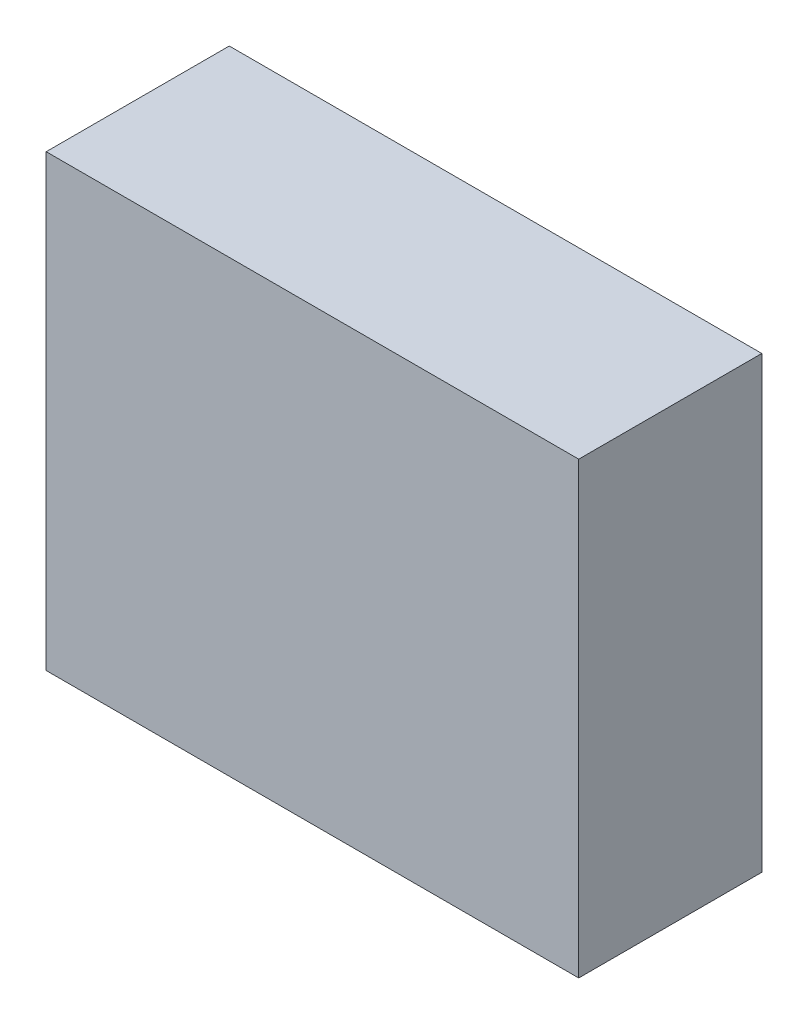
ISO-10303-21;
HEADER;
FILE_DESCRIPTION(('STEP AP214'),'2;1');
FILE_NAME('part.step','',(''),(''),'','','');
FILE_SCHEMA(('AUTOMOTIVE_DESIGN { 1 0 10303 214 1 1 1 1 }'));
ENDSEC;
DATA;
#1=APPLICATION_CONTEXT('core data for automotive mechanical design processes');
#2=APPLICATION_PROTOCOL_DEFINITION('international standard','automotive_design',2000,#1);
#3=PRODUCT_CONTEXT('',#1,'mechanical');
#4=PRODUCT('Part','Part','',(#3));
#5=PRODUCT_RELATED_PRODUCT_CATEGORY('part','',(#4));
#6=PRODUCT_DEFINITION_FORMATION('','',#4);
#7=PRODUCT_DEFINITION_CONTEXT('part definition',#1,'design');
#8=PRODUCT_DEFINITION('design','',#6,#7);
#9=PRODUCT_DEFINITION_SHAPE('','',#8);
#10=(LENGTH_UNIT() NAMED_UNIT(*) SI_UNIT(.MILLI.,.METRE.));
#11=(NAMED_UNIT(*) PLANE_ANGLE_UNIT() SI_UNIT($,.RADIAN.));
#12=(NAMED_UNIT(*) SI_UNIT($,.STERADIAN.) SOLID_ANGLE_UNIT());
#13=UNCERTAINTY_MEASURE_WITH_UNIT(LENGTH_MEASURE(1.E-05),#10,'distance_accuracy_value','');
#14=(GEOMETRIC_REPRESENTATION_CONTEXT(3) GLOBAL_UNCERTAINTY_ASSIGNED_CONTEXT((#13)) GLOBAL_UNIT_ASSIGNED_CONTEXT((#10,
#11,#12)) REPRESENTATION_CONTEXT('',''));
#15=CARTESIAN_POINT('',(0.,0.,0.));
#16=DIRECTION('',(0.,0.,1.));
#17=DIRECTION('',(1.,0.,0.));
#18=AXIS2_PLACEMENT_3D('',#15,#16,#17);
#19=CARTESIAN_POINT('',(17.750028,42.900092,1.422654));
#20=DIRECTION('',(1.,0.,0.));
#21=DIRECTION('',(0.,1.,0.));
#22=AXIS2_PLACEMENT_3D('',#19,#20,#21);
#23=PLANE('',#22);
#24=DIRECTION('',(0.,0.,1.));
#25=VECTOR('',#24,1.);
#26=CARTESIAN_POINT('',(17.750028,40.200072,0.32258));
#27=LINE('',#26,#25);
#28=CARTESIAN_POINT('',(17.750028,40.200072,0.32258));
#29=VERTEX_POINT('',#28);
#30=CARTESIAN_POINT('',(17.750028,40.200072,1.422654));
#31=VERTEX_POINT('',#30);
#32=EDGE_CURVE('E11',#29,#31,#27,.T.);
#33=ORIENTED_EDGE('',*,*,#32,.T.);
#34=DIRECTION('',(0.,1.,0.));
#35=VECTOR('',#34,1.);
#36=CARTESIAN_POINT('',(17.750028,40.200072,1.422654));
#37=LINE('',#36,#35);
#38=CARTESIAN_POINT('',(17.750028,42.900092,1.422654));
#39=VERTEX_POINT('',#38);
#40=EDGE_CURVE('E75',#31,#39,#37,.T.);
#41=ORIENTED_EDGE('',*,*,#40,.T.);
#42=DIRECTION('',(0.,0.,1.));
#43=VECTOR('',#42,1.);
#44=CARTESIAN_POINT('',(17.750028,42.900092,0.32258));
#45=LINE('',#44,#43);
#46=CARTESIAN_POINT('',(17.750028,42.900092,0.32258));
#47=VERTEX_POINT('',#46);
#48=EDGE_CURVE('E71',#47,#39,#45,.T.);
#49=ORIENTED_EDGE('',*,*,#48,.F.);
#50=DIRECTION('',(0.,-1.,0.));
#51=VECTOR('',#50,1.);
#52=CARTESIAN_POINT('',(17.750028,42.900092,0.32258));
#53=LINE('',#52,#51);
#54=EDGE_CURVE('E99',#47,#29,#53,.T.);
#55=ORIENTED_EDGE('',*,*,#54,.T.);
#56=EDGE_LOOP('',(#33,#41,#49,#55));
#57=FACE_BOUND('',#56,.T.);
#58=ADVANCED_FACE('F17',(#57),#23,.F.);
#59=CARTESIAN_POINT('',(17.750028,40.200072,1.422654));
#60=DIRECTION('',(0.,1.,0.));
#61=DIRECTION('',(1.,0.,0.));
#62=AXIS2_PLACEMENT_3D('',#59,#60,#61);
#63=PLANE('',#62);
#64=DIRECTION('',(0.,0.,-1.));
#65=VECTOR('',#64,1.);
#66=CARTESIAN_POINT('',(20.94992,40.200072,1.422654));
#67=LINE('',#66,#65);
#68=CARTESIAN_POINT('',(20.94992,40.200072,1.422654));
#69=VERTEX_POINT('',#68);
#70=CARTESIAN_POINT('',(20.94992,40.200072,0.32258));
#71=VERTEX_POINT('',#70);
#72=EDGE_CURVE('E84',#69,#71,#67,.T.);
#73=ORIENTED_EDGE('',*,*,#72,.F.);
#74=DIRECTION('',(-1.,0.,0.));
#75=VECTOR('',#74,1.);
#76=CARTESIAN_POINT('',(20.94992,40.200072,1.422654));
#77=LINE('',#76,#75);
#78=EDGE_CURVE('E27',#69,#31,#77,.T.);
#79=ORIENTED_EDGE('',*,*,#78,.T.);
#80=ORIENTED_EDGE('',*,*,#32,.F.);
#81=DIRECTION('',(1.,0.,0.));
#82=VECTOR('',#81,1.);
#83=CARTESIAN_POINT('',(17.750028,40.200072,0.32258));
#84=LINE('',#83,#82);
#85=EDGE_CURVE('E98',#29,#71,#84,.T.);
#86=ORIENTED_EDGE('',*,*,#85,.T.);
#87=EDGE_LOOP('',(#73,#79,#80,#86));
#88=FACE_BOUND('',#87,.T.);
#89=ADVANCED_FACE('F19',(#88),#63,.F.);
#90=CARTESIAN_POINT('',(0.,0.,1.422654));
#91=DIRECTION('',(0.,0.,1.));
#92=DIRECTION('',(1.,0.,0.));
#93=AXIS2_PLACEMENT_3D('',#90,#91,#92);
#94=PLANE('',#93);
#95=DIRECTION('',(1.,0.,0.));
#96=VECTOR('',#95,1.);
#97=CARTESIAN_POINT('',(17.750028,42.900092,1.422654));
#98=LINE('',#97,#96);
#99=CARTESIAN_POINT('',(20.94992,42.900092,1.422654));
#100=VERTEX_POINT('',#99);
#101=EDGE_CURVE('E65',#39,#100,#98,.T.);
#102=ORIENTED_EDGE('',*,*,#101,.F.);
#103=ORIENTED_EDGE('',*,*,#40,.F.);
#104=ORIENTED_EDGE('',*,*,#78,.F.);
#105=DIRECTION('',(0.,-1.,0.));
#106=VECTOR('',#105,1.);
#107=CARTESIAN_POINT('',(20.94992,42.900092,1.422654));
#108=LINE('',#107,#106);
#109=EDGE_CURVE('E78',#100,#69,#108,.T.);
#110=ORIENTED_EDGE('',*,*,#109,.F.);
#111=EDGE_LOOP('',(#102,#103,#104,#110));
#112=FACE_BOUND('',#111,.T.);
#113=ADVANCED_FACE('F79',(#112),#94,.T.);
#114=CARTESIAN_POINT('',(20.94992,42.900092,1.422654));
#115=DIRECTION('',(0.,-1.,0.));
#116=DIRECTION('',(0.,0.,-1.));
#117=AXIS2_PLACEMENT_3D('',#114,#115,#116);
#118=PLANE('',#117);
#119=ORIENTED_EDGE('',*,*,#48,.T.);
#120=ORIENTED_EDGE('',*,*,#101,.T.);
#121=DIRECTION('',(0.,0.,1.));
#122=VECTOR('',#121,1.);
#123=CARTESIAN_POINT('',(20.94992,42.900092,0.32258));
#124=LINE('',#123,#122);
#125=CARTESIAN_POINT('',(20.94992,42.900092,0.32258));
#126=VERTEX_POINT('',#125);
#127=EDGE_CURVE('E70',#126,#100,#124,.T.);
#128=ORIENTED_EDGE('',*,*,#127,.F.);
#129=DIRECTION('',(-1.,0.,0.));
#130=VECTOR('',#129,1.);
#131=CARTESIAN_POINT('',(20.94992,42.900092,0.32258));
#132=LINE('',#131,#130);
#133=EDGE_CURVE('E102',#126,#47,#132,.T.);
#134=ORIENTED_EDGE('',*,*,#133,.T.);
#135=EDGE_LOOP('',(#119,#120,#128,#134));
#136=FACE_BOUND('',#135,.T.);
#137=ADVANCED_FACE('F67',(#136),#118,.F.);
#138=CARTESIAN_POINT('',(0.,0.,0.32258));
#139=DIRECTION('',(0.,0.,1.));
#140=DIRECTION('',(1.,0.,0.));
#141=AXIS2_PLACEMENT_3D('',#138,#139,#140);
#142=PLANE('',#141);
#143=ORIENTED_EDGE('',*,*,#85,.F.);
#144=ORIENTED_EDGE('',*,*,#54,.F.);
#145=ORIENTED_EDGE('',*,*,#133,.F.);
#146=DIRECTION('',(0.,1.,0.));
#147=VECTOR('',#146,1.);
#148=CARTESIAN_POINT('',(20.94992,40.200072,0.32258));
#149=LINE('',#148,#147);
#150=EDGE_CURVE('E88',#71,#126,#149,.T.);
#151=ORIENTED_EDGE('',*,*,#150,.F.);
#152=EDGE_LOOP('',(#143,#144,#145,#151));
#153=FACE_BOUND('',#152,.T.);
#154=ADVANCED_FACE('F119',(#153),#142,.F.);
#155=CARTESIAN_POINT('',(20.94992,40.200072,1.422654));
#156=DIRECTION('',(-1.,0.,0.));
#157=DIRECTION('',(0.,0.,1.));
#158=AXIS2_PLACEMENT_3D('',#155,#156,#157);
#159=PLANE('',#158);
#160=ORIENTED_EDGE('',*,*,#127,.T.);
#161=ORIENTED_EDGE('',*,*,#109,.T.);
#162=ORIENTED_EDGE('',*,*,#72,.T.);
#163=ORIENTED_EDGE('',*,*,#150,.T.);
#164=EDGE_LOOP('',(#160,#161,#162,#163));
#165=FACE_BOUND('',#164,.T.);
#166=ADVANCED_FACE('F86',(#165),#159,.F.);
#167=CLOSED_SHELL('',(#58,#89,#113,#137,#154,#166));
#168=MANIFOLD_SOLID_BREP('B1',#167);
#169=ADVANCED_BREP_SHAPE_REPRESENTATION('',(#18,#168),#14);
#170=SHAPE_DEFINITION_REPRESENTATION(#9,#169);
ENDSEC;
END-ISO-10303-21;
